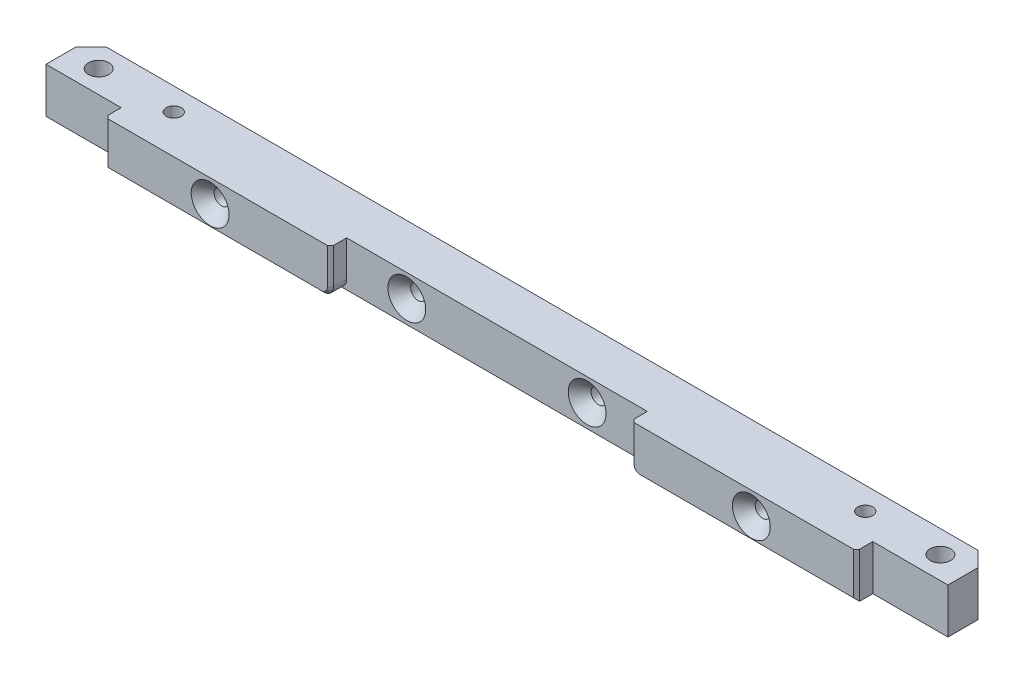
ISO-10303-21;
HEADER;
FILE_DESCRIPTION(('STEP AP214'),'2;1');
FILE_NAME('part.step','',(''),(''),'','','');
FILE_SCHEMA(('AUTOMOTIVE_DESIGN { 1 0 10303 214 1 1 1 1 }'));
ENDSEC;
DATA;
#1=APPLICATION_CONTEXT('core data for automotive mechanical design processes');
#2=APPLICATION_PROTOCOL_DEFINITION('international standard','automotive_design',2000,#1);
#3=PRODUCT_CONTEXT('',#1,'mechanical');
#4=PRODUCT('Part','Part','',(#3));
#5=PRODUCT_RELATED_PRODUCT_CATEGORY('part','',(#4));
#6=PRODUCT_DEFINITION_FORMATION('','',#4);
#7=PRODUCT_DEFINITION_CONTEXT('part definition',#1,'design');
#8=PRODUCT_DEFINITION('design','',#6,#7);
#9=PRODUCT_DEFINITION_SHAPE('','',#8);
#10=(LENGTH_UNIT() NAMED_UNIT(*) SI_UNIT(.MILLI.,.METRE.));
#11=(NAMED_UNIT(*) PLANE_ANGLE_UNIT() SI_UNIT($,.RADIAN.));
#12=(NAMED_UNIT(*) SI_UNIT($,.STERADIAN.) SOLID_ANGLE_UNIT());
#13=UNCERTAINTY_MEASURE_WITH_UNIT(LENGTH_MEASURE(1.E-05),#10,'distance_accuracy_value','');
#14=(GEOMETRIC_REPRESENTATION_CONTEXT(3) GLOBAL_UNCERTAINTY_ASSIGNED_CONTEXT((#13)) GLOBAL_UNIT_ASSIGNED_CONTEXT((#10,
#11,#12)) REPRESENTATION_CONTEXT('',''));
#15=CARTESIAN_POINT('',(0.,0.,0.));
#16=DIRECTION('',(0.,0.,1.));
#17=DIRECTION('',(1.,0.,0.));
#18=AXIS2_PLACEMENT_3D('',#15,#16,#17);
#19=CARTESIAN_POINT('',(0.,0.,12.9));
#20=DIRECTION('',(0.,0.,1.));
#21=DIRECTION('',(1.,0.,0.));
#22=AXIS2_PLACEMENT_3D('',#19,#20,#21);
#23=PLANE('',#22);
#24=CARTESIAN_POINT('',(-90.,7.50000000000002,12.9));
#25=DIRECTION('',(0.,0.,1.));
#26=DIRECTION('',(1.,0.,0.));
#27=AXIS2_PLACEMENT_3D('',#24,#25,#26);
#28=CIRCLE('',#27,6.3);
#29=CARTESIAN_POINT('',(-83.7,7.50000000000002,12.9));
#30=VERTEX_POINT('',#29);
#31=EDGE_CURVE('E577',#30,#30,#28,.T.);
#32=ORIENTED_EDGE('',*,*,#31,.F.);
#33=EDGE_LOOP('',(#32));
#34=FACE_BOUND('',#33,.T.);
#35=CARTESIAN_POINT('',(-53.,3.,12.9));
#36=DIRECTION('',(0.,0.,1.));
#37=DIRECTION('',(1.,0.,0.));
#38=AXIS2_PLACEMENT_3D('',#35,#36,#37);
#39=CIRCLE('',#38,2.);
#40=CARTESIAN_POINT('',(-53.,1.,12.9));
#41=VERTEX_POINT('',#40);
#42=CARTESIAN_POINT('',(-51.,3.,12.9));
#43=VERTEX_POINT('',#42);
#44=EDGE_CURVE('E66',#41,#43,#39,.T.);
#45=ORIENTED_EDGE('',*,*,#44,.T.);
#46=DIRECTION('',(0.,1.,0.));
#47=VECTOR('',#46,1.);
#48=CARTESIAN_POINT('',(-51.,15.,12.9));
#49=LINE('',#48,#47);
#50=CARTESIAN_POINT('',(-51.,15.,12.9));
#51=VERTEX_POINT('',#50);
#52=EDGE_CURVE('E411',#43,#51,#49,.T.);
#53=ORIENTED_EDGE('',*,*,#52,.T.);
#54=DIRECTION('',(-1.,0.,0.));
#55=VECTOR('',#54,1.);
#56=CARTESIAN_POINT('',(-125.,15.,12.9));
#57=LINE('',#56,#55);
#58=CARTESIAN_POINT('',(-124.,15.,12.9));
#59=VERTEX_POINT('',#58);
#60=EDGE_CURVE('E223',#51,#59,#57,.T.);
#61=ORIENTED_EDGE('',*,*,#60,.T.);
#62=DIRECTION('',(0.,-1.,0.));
#63=VECTOR('',#62,1.);
#64=CARTESIAN_POINT('',(-124.,0.,12.9));
#65=LINE('',#64,#63);
#66=CARTESIAN_POINT('',(-124.,1.,12.9));
#67=VERTEX_POINT('',#66);
#68=EDGE_CURVE('E403',#59,#67,#65,.T.);
#69=ORIENTED_EDGE('',*,*,#68,.T.);
#70=DIRECTION('',(1.,0.,0.));
#71=VECTOR('',#70,1.);
#72=CARTESIAN_POINT('',(-53.,1.,12.9));
#73=LINE('',#72,#71);
#74=EDGE_CURVE('E406',#67,#41,#73,.T.);
#75=ORIENTED_EDGE('',*,*,#74,.T.);
#76=EDGE_LOOP('',(#45,#53,#61,#69,#75));
#77=FACE_BOUND('',#76,.T.);
#78=ADVANCED_FACE('F41',(#34,#77),#23,.T.);
#79=CARTESIAN_POINT('',(-150.,15.,7.5));
#80=DIRECTION('',(0.,0.,-1.));
#81=DIRECTION('',(-1.,0.,0.));
#82=AXIS2_PLACEMENT_3D('',#79,#80,#81);
#83=PLANE('',#82);
#84=DIRECTION('',(0.,-1.,0.));
#85=VECTOR('',#84,1.);
#86=CARTESIAN_POINT('',(-125.,15.,7.5));
#87=LINE('',#86,#85);
#88=CARTESIAN_POINT('',(-125.,15.,7.5));
#89=VERTEX_POINT('',#88);
#90=CARTESIAN_POINT('',(-125.,0.,7.5));
#91=VERTEX_POINT('',#90);
#92=EDGE_CURVE('E221',#89,#91,#87,.T.);
#93=ORIENTED_EDGE('',*,*,#92,.F.);
#94=DIRECTION('',(1.,0.,0.));
#95=VECTOR('',#94,1.);
#96=CARTESIAN_POINT('',(-150.,15.,7.5));
#97=LINE('',#96,#95);
#98=CARTESIAN_POINT('',(-150.,15.,7.5));
#99=VERTEX_POINT('',#98);
#100=EDGE_CURVE('E293',#99,#89,#97,.T.);
#101=ORIENTED_EDGE('',*,*,#100,.F.);
#102=DIRECTION('',(0.,-1.,0.));
#103=VECTOR('',#102,1.);
#104=CARTESIAN_POINT('',(-150.,15.,7.5));
#105=LINE('',#104,#103);
#106=CARTESIAN_POINT('',(-150.,0.,7.5));
#107=VERTEX_POINT('',#106);
#108=EDGE_CURVE('E315',#99,#107,#105,.T.);
#109=ORIENTED_EDGE('',*,*,#108,.T.);
#110=DIRECTION('',(1.,0.,0.));
#111=VECTOR('',#110,1.);
#112=CARTESIAN_POINT('',(-150.,0.,7.5));
#113=LINE('',#112,#111);
#114=EDGE_CURVE('E285',#107,#91,#113,.T.);
#115=ORIENTED_EDGE('',*,*,#114,.T.);
#116=EDGE_LOOP('',(#93,#101,#109,#115));
#117=FACE_BOUND('',#116,.T.);
#118=ADVANCED_FACE('F469',(#117),#83,.F.);
#119=DIRECTION('',(0.,1.,0.));
#120=VECTOR('',#119,1.);
#121=CARTESIAN_POINT('',(125.,15.,7.5));
#122=LINE('',#121,#120);
#123=CARTESIAN_POINT('',(125.,0.,7.5));
#124=VERTEX_POINT('',#123);
#125=CARTESIAN_POINT('',(125.,15.,7.5));
#126=VERTEX_POINT('',#125);
#127=EDGE_CURVE('E228',#124,#126,#122,.T.);
#128=ORIENTED_EDGE('',*,*,#127,.F.);
#129=CARTESIAN_POINT('',(150.,0.,7.5));
#130=VERTEX_POINT('',#129);
#131=EDGE_CURVE('E308',#124,#130,#113,.T.);
#132=ORIENTED_EDGE('',*,*,#131,.T.);
#133=DIRECTION('',(0.,-1.,0.));
#134=VECTOR('',#133,1.);
#135=CARTESIAN_POINT('',(150.,15.,7.5));
#136=LINE('',#135,#134);
#137=CARTESIAN_POINT('',(150.,15.,7.5));
#138=VERTEX_POINT('',#137);
#139=EDGE_CURVE('E297',#138,#130,#136,.T.);
#140=ORIENTED_EDGE('',*,*,#139,.F.);
#141=EDGE_CURVE('E292',#126,#138,#97,.T.);
#142=ORIENTED_EDGE('',*,*,#141,.F.);
#143=EDGE_LOOP('',(#128,#132,#140,#142));
#144=FACE_BOUND('',#143,.T.);
#145=ADVANCED_FACE('F507',(#144),#83,.F.);
#146=CARTESIAN_POINT('',(150.,15.,-7.5));
#147=DIRECTION('',(-1.,0.,0.));
#148=DIRECTION('',(0.,0.,1.));
#149=AXIS2_PLACEMENT_3D('',#146,#147,#148);
#150=PLANE('',#149);
#151=DIRECTION('',(0.,0.,-1.));
#152=VECTOR('',#151,1.);
#153=CARTESIAN_POINT('',(150.,0.,-7.5));
#154=LINE('',#153,#152);
#155=CARTESIAN_POINT('',(150.,0.,-2.5));
#156=VERTEX_POINT('',#155);
#157=EDGE_CURVE('E279',#130,#156,#154,.T.);
#158=ORIENTED_EDGE('',*,*,#157,.T.);
#159=DIRECTION('',(0.,1.,0.));
#160=VECTOR('',#159,1.);
#161=CARTESIAN_POINT('',(150.,15.,-2.5));
#162=LINE('',#161,#160);
#163=CARTESIAN_POINT('',(150.,15.,-2.5));
#164=VERTEX_POINT('',#163);
#165=EDGE_CURVE('E351',#156,#164,#162,.T.);
#166=ORIENTED_EDGE('',*,*,#165,.T.);
#167=DIRECTION('',(0.,0.,-1.));
#168=VECTOR('',#167,1.);
#169=CARTESIAN_POINT('',(150.,15.,-7.5));
#170=LINE('',#169,#168);
#171=EDGE_CURVE('E280',#138,#164,#170,.T.);
#172=ORIENTED_EDGE('',*,*,#171,.F.);
#173=ORIENTED_EDGE('',*,*,#139,.T.);
#174=EDGE_LOOP('',(#158,#166,#172,#173));
#175=FACE_BOUND('',#174,.T.);
#176=ADVANCED_FACE('F799',(#175),#150,.F.);
#177=CARTESIAN_POINT('',(-150.,15.,-7.5));
#178=DIRECTION('',(0.,0.,1.));
#179=DIRECTION('',(1.,0.,0.));
#180=AXIS2_PLACEMENT_3D('',#177,#178,#179);
#181=PLANE('',#180);
#182=CARTESIAN_POINT('',(-30.,7.50000000000003,-7.5));
#183=DIRECTION('',(0.,0.,1.));
#184=DIRECTION('',(1.,0.,0.));
#185=AXIS2_PLACEMENT_3D('',#182,#183,#184);
#186=CIRCLE('',#185,2.5);
#187=CARTESIAN_POINT('',(-27.5,7.50000000000003,-7.5));
#188=VERTEX_POINT('',#187);
#189=EDGE_CURVE('E593',#188,#188,#186,.T.);
#190=ORIENTED_EDGE('',*,*,#189,.T.);
#191=EDGE_LOOP('',(#190));
#192=FACE_BOUND('',#191,.T.);
#193=CARTESIAN_POINT('',(30.,7.50000000000003,-7.5));
#194=DIRECTION('',(0.,0.,1.));
#195=DIRECTION('',(1.,0.,0.));
#196=AXIS2_PLACEMENT_3D('',#193,#194,#195);
#197=CIRCLE('',#196,2.5);
#198=CARTESIAN_POINT('',(32.5,7.50000000000003,-7.5));
#199=VERTEX_POINT('',#198);
#200=EDGE_CURVE('E581',#199,#199,#197,.T.);
#201=ORIENTED_EDGE('',*,*,#200,.T.);
#202=EDGE_LOOP('',(#201));
#203=FACE_BOUND('',#202,.T.);
#204=CARTESIAN_POINT('',(-90.,7.50000000000002,-7.5));
#205=DIRECTION('',(0.,0.,1.));
#206=DIRECTION('',(1.,0.,0.));
#207=AXIS2_PLACEMENT_3D('',#204,#205,#206);
#208=CIRCLE('',#207,2.49999999999999);
#209=CARTESIAN_POINT('',(-87.5,7.50000000000002,-7.5));
#210=VERTEX_POINT('',#209);
#211=EDGE_CURVE('E569',#210,#210,#208,.T.);
#212=ORIENTED_EDGE('',*,*,#211,.T.);
#213=EDGE_LOOP('',(#212));
#214=FACE_BOUND('',#213,.T.);
#215=CARTESIAN_POINT('',(90.,7.50000000000004,-7.5));
#216=DIRECTION('',(0.,0.,1.));
#217=DIRECTION('',(1.,0.,0.));
#218=AXIS2_PLACEMENT_3D('',#215,#216,#217);
#219=CIRCLE('',#218,2.49999999999999);
#220=CARTESIAN_POINT('',(92.5,7.50000000000004,-7.5));
#221=VERTEX_POINT('',#220);
#222=EDGE_CURVE('E557',#221,#221,#219,.T.);
#223=ORIENTED_EDGE('',*,*,#222,.T.);
#224=EDGE_LOOP('',(#223));
#225=FACE_BOUND('',#224,.T.);
#226=DIRECTION('',(-1.,0.,0.));
#227=VECTOR('',#226,1.);
#228=CARTESIAN_POINT('',(-150.,15.,-7.5));
#229=LINE('',#228,#227);
#230=CARTESIAN_POINT('',(145.,15.,-7.5));
#231=VERTEX_POINT('',#230);
#232=CARTESIAN_POINT('',(-145.,15.,-7.5));
#233=VERTEX_POINT('',#232);
#234=EDGE_CURVE('E284',#231,#233,#229,.T.);
#235=ORIENTED_EDGE('',*,*,#234,.F.);
#236=DIRECTION('',(0.,-1.,0.));
#237=VECTOR('',#236,1.);
#238=CARTESIAN_POINT('',(145.,15.,-7.5));
#239=LINE('',#238,#237);
#240=CARTESIAN_POINT('',(145.,0.,-7.5));
#241=VERTEX_POINT('',#240);
#242=EDGE_CURVE('E341',#231,#241,#239,.T.);
#243=ORIENTED_EDGE('',*,*,#242,.T.);
#244=DIRECTION('',(-1.,0.,0.));
#245=VECTOR('',#244,1.);
#246=CARTESIAN_POINT('',(-150.,0.,-7.5));
#247=LINE('',#246,#245);
#248=CARTESIAN_POINT('',(-145.,0.,-7.5));
#249=VERTEX_POINT('',#248);
#250=EDGE_CURVE('E301',#241,#249,#247,.T.);
#251=ORIENTED_EDGE('',*,*,#250,.T.);
#252=DIRECTION('',(0.,1.,0.));
#253=VECTOR('',#252,1.);
#254=CARTESIAN_POINT('',(-145.,15.,-7.5));
#255=LINE('',#254,#253);
#256=EDGE_CURVE('E338',#249,#233,#255,.T.);
#257=ORIENTED_EDGE('',*,*,#256,.T.);
#258=EDGE_LOOP('',(#235,#243,#251,#257));
#259=FACE_BOUND('',#258,.T.);
#260=ADVANCED_FACE('F482',(#192,#203,#214,#225,#259),#181,.F.);
#261=CARTESIAN_POINT('',(-150.,15.,-7.5));
#262=DIRECTION('',(1.,0.,0.));
#263=DIRECTION('',(0.,0.,-1.));
#264=AXIS2_PLACEMENT_3D('',#261,#262,#263);
#265=PLANE('',#264);
#266=DIRECTION('',(0.,0.,1.));
#267=VECTOR('',#266,1.);
#268=CARTESIAN_POINT('',(-150.,15.,-7.5));
#269=LINE('',#268,#267);
#270=CARTESIAN_POINT('',(-150.,15.,-2.5));
#271=VERTEX_POINT('',#270);
#272=EDGE_CURVE('E289',#271,#99,#269,.T.);
#273=ORIENTED_EDGE('',*,*,#272,.F.);
#274=DIRECTION('',(0.,-1.,0.));
#275=VECTOR('',#274,1.);
#276=CARTESIAN_POINT('',(-150.,15.,-2.5));
#277=LINE('',#276,#275);
#278=CARTESIAN_POINT('',(-150.,0.,-2.5));
#279=VERTEX_POINT('',#278);
#280=EDGE_CURVE('E360',#271,#279,#277,.T.);
#281=ORIENTED_EDGE('',*,*,#280,.T.);
#282=DIRECTION('',(0.,0.,1.));
#283=VECTOR('',#282,1.);
#284=CARTESIAN_POINT('',(-150.,0.,-7.5));
#285=LINE('',#284,#283);
#286=EDGE_CURVE('E305',#279,#107,#285,.T.);
#287=ORIENTED_EDGE('',*,*,#286,.T.);
#288=ORIENTED_EDGE('',*,*,#108,.F.);
#289=EDGE_LOOP('',(#273,#281,#287,#288));
#290=FACE_BOUND('',#289,.T.);
#291=ADVANCED_FACE('F475',(#290),#265,.F.);
#292=CARTESIAN_POINT('',(0.,15.,0.));
#293=DIRECTION('',(0.,1.,0.));
#294=DIRECTION('',(0.,0.,1.));
#295=AXIS2_PLACEMENT_3D('',#292,#293,#294);
#296=PLANE('',#295);
#297=CARTESIAN_POINT('',(124.,15.,12.9));
#298=VERTEX_POINT('',#297);
#299=CARTESIAN_POINT('',(51.,15.,12.9));
#300=VERTEX_POINT('',#299);
#301=EDGE_CURVE('E227',#298,#300,#57,.T.);
#302=ORIENTED_EDGE('',*,*,#301,.F.);
#303=DIRECTION('',(0.707106781186548,0.,-0.707106781186548));
#304=VECTOR('',#303,1.);
#305=CARTESIAN_POINT('',(68.45,15.,68.45));
#306=LINE('',#305,#304);
#307=CARTESIAN_POINT('',(125.,15.,11.9));
#308=VERTEX_POINT('',#307);
#309=EDGE_CURVE('E386',#298,#308,#306,.T.);
#310=ORIENTED_EDGE('',*,*,#309,.T.);
#311=DIRECTION('',(0.,0.,-1.));
#312=VECTOR('',#311,1.);
#313=CARTESIAN_POINT('',(125.,15.,12.9));
#314=LINE('',#313,#312);
#315=EDGE_CURVE('E238',#308,#126,#314,.T.);
#316=ORIENTED_EDGE('',*,*,#315,.T.);
#317=ORIENTED_EDGE('',*,*,#141,.T.);
#318=ORIENTED_EDGE('',*,*,#171,.T.);
#319=DIRECTION('',(0.707106781186544,0.,0.707106781186551));
#320=VECTOR('',#319,1.);
#321=CARTESIAN_POINT('',(76.2500000000008,15.,-76.25));
#322=LINE('',#321,#320);
#323=EDGE_CURVE('E357',#164,#231,#322,.F.);
#324=ORIENTED_EDGE('',*,*,#323,.T.);
#325=ORIENTED_EDGE('',*,*,#234,.T.);
#326=DIRECTION('',(0.707106781186549,0.,-0.707106781186546));
#327=VECTOR('',#326,1.);
#328=CARTESIAN_POINT('',(-76.2499999999996,15.,-76.25));
#329=LINE('',#328,#327);
#330=EDGE_CURVE('E354',#233,#271,#329,.F.);
#331=ORIENTED_EDGE('',*,*,#330,.T.);
#332=ORIENTED_EDGE('',*,*,#272,.T.);
#333=ORIENTED_EDGE('',*,*,#100,.T.);
#334=DIRECTION('',(0.,0.,-1.));
#335=VECTOR('',#334,1.);
#336=CARTESIAN_POINT('',(-125.,15.,12.9));
#337=LINE('',#336,#335);
#338=CARTESIAN_POINT('',(-125.,15.,11.9));
#339=VERTEX_POINT('',#338);
#340=EDGE_CURVE('E235',#339,#89,#337,.T.);
#341=ORIENTED_EDGE('',*,*,#340,.F.);
#342=DIRECTION('',(0.707106781186548,0.,0.707106781186548));
#343=VECTOR('',#342,1.);
#344=CARTESIAN_POINT('',(-68.45,15.,68.45));
#345=LINE('',#344,#343);
#346=EDGE_CURVE('E377',#339,#59,#345,.T.);
#347=ORIENTED_EDGE('',*,*,#346,.T.);
#348=ORIENTED_EDGE('',*,*,#60,.F.);
#349=DIRECTION('',(0.707106781186548,0.,-0.707106781186548));
#350=VECTOR('',#349,1.);
#351=CARTESIAN_POINT('',(-19.05,15.,-19.05));
#352=LINE('',#351,#350);
#353=CARTESIAN_POINT('',(-50.,15.,11.9));
#354=VERTEX_POINT('',#353);
#355=EDGE_CURVE('E380',#51,#354,#352,.T.);
#356=ORIENTED_EDGE('',*,*,#355,.T.);
#357=DIRECTION('',(0.,0.,1.));
#358=VECTOR('',#357,1.);
#359=CARTESIAN_POINT('',(-50.,15.,7.5));
#360=LINE('',#359,#358);
#361=CARTESIAN_POINT('',(-50.,15.,7.5));
#362=VERTEX_POINT('',#361);
#363=EDGE_CURVE('E211',#362,#354,#360,.T.);
#364=ORIENTED_EDGE('',*,*,#363,.F.);
#365=DIRECTION('',(-1.,0.,0.));
#366=VECTOR('',#365,1.);
#367=CARTESIAN_POINT('',(-50.,15.,7.5));
#368=LINE('',#367,#366);
#369=CARTESIAN_POINT('',(50.,15.,7.5));
#370=VERTEX_POINT('',#369);
#371=EDGE_CURVE('E192',#370,#362,#368,.T.);
#372=ORIENTED_EDGE('',*,*,#371,.F.);
#373=DIRECTION('',(0.,0.,1.));
#374=VECTOR('',#373,1.);
#375=CARTESIAN_POINT('',(50.,15.,7.5));
#376=LINE('',#375,#374);
#377=CARTESIAN_POINT('',(50.,15.,11.9));
#378=VERTEX_POINT('',#377);
#379=EDGE_CURVE('E204',#370,#378,#376,.T.);
#380=ORIENTED_EDGE('',*,*,#379,.T.);
#381=DIRECTION('',(0.707106781186548,0.,0.707106781186548));
#382=VECTOR('',#381,1.);
#383=CARTESIAN_POINT('',(19.05,15.,-19.05));
#384=LINE('',#383,#382);
#385=EDGE_CURVE('E383',#378,#300,#384,.T.);
#386=ORIENTED_EDGE('',*,*,#385,.T.);
#387=EDGE_LOOP('',(#302,#310,#316,#317,#318,#324,#325,#331,#332,#333,#341,#347,#348,#356,#364,
#372,#380,#386));
#388=FACE_BOUND('',#387,.T.);
#389=CARTESIAN_POINT('',(-140.,15.,0.));
#390=DIRECTION('',(0.,1.,0.));
#391=DIRECTION('',(0.,0.,1.));
#392=AXIS2_PLACEMENT_3D('',#389,#390,#391);
#393=CIRCLE('',#392,3.39999999999999);
#394=CARTESIAN_POINT('',(-140.,15.,3.39999999999999));
#395=VERTEX_POINT('',#394);
#396=EDGE_CURVE('E247',#395,#395,#393,.T.);
#397=ORIENTED_EDGE('',*,*,#396,.F.);
#398=EDGE_LOOP('',(#397));
#399=FACE_BOUND('',#398,.T.);
#400=CARTESIAN_POINT('',(140.,15.,0.));
#401=DIRECTION('',(0.,1.,0.));
#402=DIRECTION('',(0.,0.,1.));
#403=AXIS2_PLACEMENT_3D('',#400,#401,#402);
#404=CIRCLE('',#403,3.39999999999999);
#405=CARTESIAN_POINT('',(140.,15.,3.39999999999999));
#406=VERTEX_POINT('',#405);
#407=EDGE_CURVE('E255',#406,#406,#404,.T.);
#408=ORIENTED_EDGE('',*,*,#407,.F.);
#409=EDGE_LOOP('',(#408));
#410=FACE_BOUND('',#409,.T.);
#411=CARTESIAN_POINT('',(-115.,15.,0.));
#412=DIRECTION('',(0.,1.,0.));
#413=DIRECTION('',(0.,0.,1.));
#414=AXIS2_PLACEMENT_3D('',#411,#412,#413);
#415=CIRCLE('',#414,2.49999999999999);
#416=CARTESIAN_POINT('',(-115.,15.,2.49999999999999));
#417=VERTEX_POINT('',#416);
#418=EDGE_CURVE('E263',#417,#417,#415,.T.);
#419=ORIENTED_EDGE('',*,*,#418,.F.);
#420=EDGE_LOOP('',(#419));
#421=FACE_BOUND('',#420,.T.);
#422=CARTESIAN_POINT('',(115.,15.,0.));
#423=DIRECTION('',(0.,1.,0.));
#424=DIRECTION('',(0.,0.,1.));
#425=AXIS2_PLACEMENT_3D('',#422,#423,#424);
#426=CIRCLE('',#425,2.49999999999999);
#427=CARTESIAN_POINT('',(115.,15.,2.49999999999999));
#428=VERTEX_POINT('',#427);
#429=EDGE_CURVE('E271',#428,#428,#426,.T.);
#430=ORIENTED_EDGE('',*,*,#429,.F.);
#431=EDGE_LOOP('',(#430));
#432=FACE_BOUND('',#431,.T.);
#433=ADVANCED_FACE('F214',(#388,#399,#410,#421,#432),#296,.T.);
#434=CARTESIAN_POINT('',(0.,0.,0.));
#435=DIRECTION('',(0.,1.,0.));
#436=DIRECTION('',(0.,0.,1.));
#437=AXIS2_PLACEMENT_3D('',#434,#435,#436);
#438=PLANE('',#437);
#439=CARTESIAN_POINT('',(-140.,0.,0.));
#440=DIRECTION('',(0.,1.,0.));
#441=DIRECTION('',(0.,0.,1.));
#442=AXIS2_PLACEMENT_3D('',#439,#440,#441);
#443=CIRCLE('',#442,3.39999999999999);
#444=CARTESIAN_POINT('',(-140.,0.,3.39999999999999));
#445=VERTEX_POINT('',#444);
#446=EDGE_CURVE('E251',#445,#445,#443,.T.);
#447=ORIENTED_EDGE('',*,*,#446,.T.);
#448=EDGE_LOOP('',(#447));
#449=FACE_BOUND('',#448,.T.);
#450=CARTESIAN_POINT('',(140.,0.,0.));
#451=DIRECTION('',(0.,1.,0.));
#452=DIRECTION('',(0.,0.,1.));
#453=AXIS2_PLACEMENT_3D('',#450,#451,#452);
#454=CIRCLE('',#453,3.39999999999999);
#455=CARTESIAN_POINT('',(140.,0.,3.39999999999999));
#456=VERTEX_POINT('',#455);
#457=EDGE_CURVE('E259',#456,#456,#454,.T.);
#458=ORIENTED_EDGE('',*,*,#457,.T.);
#459=EDGE_LOOP('',(#458));
#460=FACE_BOUND('',#459,.T.);
#461=CARTESIAN_POINT('',(-115.,0.,0.));
#462=DIRECTION('',(0.,1.,0.));
#463=DIRECTION('',(0.,0.,1.));
#464=AXIS2_PLACEMENT_3D('',#461,#462,#463);
#465=CIRCLE('',#464,2.49999999999999);
#466=CARTESIAN_POINT('',(-115.,0.,2.49999999999999));
#467=VERTEX_POINT('',#466);
#468=EDGE_CURVE('E267',#467,#467,#465,.T.);
#469=ORIENTED_EDGE('',*,*,#468,.T.);
#470=EDGE_LOOP('',(#469));
#471=FACE_BOUND('',#470,.T.);
#472=CARTESIAN_POINT('',(115.,0.,0.));
#473=DIRECTION('',(0.,1.,0.));
#474=DIRECTION('',(0.,0.,1.));
#475=AXIS2_PLACEMENT_3D('',#472,#473,#474);
#476=CIRCLE('',#475,2.49999999999999);
#477=CARTESIAN_POINT('',(115.,0.,2.49999999999999));
#478=VERTEX_POINT('',#477);
#479=EDGE_CURVE('E275',#478,#478,#476,.T.);
#480=ORIENTED_EDGE('',*,*,#479,.T.);
#481=EDGE_LOOP('',(#480));
#482=FACE_BOUND('',#481,.T.);
#483=DIRECTION('',(0.,0.,-1.));
#484=VECTOR('',#483,1.);
#485=CARTESIAN_POINT('',(125.,0.,12.9));
#486=LINE('',#485,#484);
#487=CARTESIAN_POINT('',(125.,0.,11.9));
#488=VERTEX_POINT('',#487);
#489=EDGE_CURVE('E241',#488,#124,#486,.T.);
#490=ORIENTED_EDGE('',*,*,#489,.F.);
#491=DIRECTION('',(-1.,0.,0.));
#492=VECTOR('',#491,1.);
#493=CARTESIAN_POINT('',(53.,0.,11.9));
#494=LINE('',#493,#492);
#495=CARTESIAN_POINT('',(53.,0.,11.9));
#496=VERTEX_POINT('',#495);
#497=EDGE_CURVE('E395',#488,#496,#494,.T.);
#498=ORIENTED_EDGE('',*,*,#497,.T.);
#499=DIRECTION('',(0.,0.,1.));
#500=VECTOR('',#499,1.);
#501=CARTESIAN_POINT('',(53.,0.,0.));
#502=LINE('',#501,#500);
#503=CARTESIAN_POINT('',(53.,0.,7.5));
#504=VERTEX_POINT('',#503);
#505=EDGE_CURVE('E326',#496,#504,#502,.F.);
#506=ORIENTED_EDGE('',*,*,#505,.T.);
#507=DIRECTION('',(1.,0.,0.));
#508=VECTOR('',#507,1.);
#509=CARTESIAN_POINT('',(-50.,0.,7.5));
#510=LINE('',#509,#508);
#511=CARTESIAN_POINT('',(-53.,0.,7.5));
#512=VERTEX_POINT('',#511);
#513=EDGE_CURVE('E201',#512,#504,#510,.T.);
#514=ORIENTED_EDGE('',*,*,#513,.F.);
#515=DIRECTION('',(0.,0.,1.));
#516=VECTOR('',#515,1.);
#517=CARTESIAN_POINT('',(-53.,0.,0.));
#518=LINE('',#517,#516);
#519=CARTESIAN_POINT('',(-53.,0.,11.9));
#520=VERTEX_POINT('',#519);
#521=EDGE_CURVE('E322',#512,#520,#518,.T.);
#522=ORIENTED_EDGE('',*,*,#521,.T.);
#523=DIRECTION('',(-1.,0.,0.));
#524=VECTOR('',#523,1.);
#525=CARTESIAN_POINT('',(-125.,0.,11.9));
#526=LINE('',#525,#524);
#527=CARTESIAN_POINT('',(-125.,0.,11.9));
#528=VERTEX_POINT('',#527);
#529=EDGE_CURVE('E392',#520,#528,#526,.T.);
#530=ORIENTED_EDGE('',*,*,#529,.T.);
#531=DIRECTION('',(0.,0.,-1.));
#532=VECTOR('',#531,1.);
#533=CARTESIAN_POINT('',(-125.,0.,12.9));
#534=LINE('',#533,#532);
#535=EDGE_CURVE('E244',#528,#91,#534,.T.);
#536=ORIENTED_EDGE('',*,*,#535,.T.);
#537=ORIENTED_EDGE('',*,*,#114,.F.);
#538=ORIENTED_EDGE('',*,*,#286,.F.);
#539=DIRECTION('',(-0.707106781186549,0.,0.707106781186546));
#540=VECTOR('',#539,1.);
#541=CARTESIAN_POINT('',(-150.,0.,-2.5));
#542=LINE('',#541,#540);
#543=EDGE_CURVE('E345',#279,#249,#542,.F.);
#544=ORIENTED_EDGE('',*,*,#543,.T.);
#545=ORIENTED_EDGE('',*,*,#250,.F.);
#546=DIRECTION('',(-0.707106781186544,0.,-0.707106781186551));
#547=VECTOR('',#546,1.);
#548=CARTESIAN_POINT('',(145.,0.,-7.5));
#549=LINE('',#548,#547);
#550=EDGE_CURVE('E348',#241,#156,#549,.F.);
#551=ORIENTED_EDGE('',*,*,#550,.T.);
#552=ORIENTED_EDGE('',*,*,#157,.F.);
#553=ORIENTED_EDGE('',*,*,#131,.F.);
#554=EDGE_LOOP('',(#490,#498,#506,#514,#522,#530,#536,#537,#538,#544,#545,#551,#552,#553));
#555=FACE_BOUND('',#554,.T.);
#556=ADVANCED_FACE('F461',(#449,#460,#471,#482,#555),#438,.F.);
#557=CARTESIAN_POINT('',(115.,15.,0.));
#558=DIRECTION('',(0.,1.,0.));
#559=DIRECTION('',(0.,0.,1.));
#560=AXIS2_PLACEMENT_3D('',#557,#558,#559);
#561=CYLINDRICAL_SURFACE('',#560,2.49999999999999);
#562=ORIENTED_EDGE('',*,*,#479,.F.);
#563=EDGE_LOOP('',(#562));
#564=FACE_BOUND('',#563,.T.);
#565=ORIENTED_EDGE('',*,*,#429,.T.);
#566=EDGE_LOOP('',(#565));
#567=FACE_BOUND('',#566,.T.);
#568=ADVANCED_FACE('F749',(#564,#567),#561,.F.);
#569=CARTESIAN_POINT('',(-115.,15.,0.));
#570=DIRECTION('',(0.,1.,0.));
#571=DIRECTION('',(0.,0.,1.));
#572=AXIS2_PLACEMENT_3D('',#569,#570,#571);
#573=CYLINDRICAL_SURFACE('',#572,2.49999999999999);
#574=ORIENTED_EDGE('',*,*,#468,.F.);
#575=EDGE_LOOP('',(#574));
#576=FACE_BOUND('',#575,.T.);
#577=ORIENTED_EDGE('',*,*,#418,.T.);
#578=EDGE_LOOP('',(#577));
#579=FACE_BOUND('',#578,.T.);
#580=ADVANCED_FACE('F824',(#576,#579),#573,.F.);
#581=CARTESIAN_POINT('',(140.,15.,0.));
#582=DIRECTION('',(0.,1.,0.));
#583=DIRECTION('',(0.,0.,1.));
#584=AXIS2_PLACEMENT_3D('',#581,#582,#583);
#585=CYLINDRICAL_SURFACE('',#584,3.39999999999999);
#586=ORIENTED_EDGE('',*,*,#457,.F.);
#587=EDGE_LOOP('',(#586));
#588=FACE_BOUND('',#587,.T.);
#589=ORIENTED_EDGE('',*,*,#407,.T.);
#590=EDGE_LOOP('',(#589));
#591=FACE_BOUND('',#590,.T.);
#592=ADVANCED_FACE('F813',(#588,#591),#585,.F.);
#593=CARTESIAN_POINT('',(-140.,15.,0.));
#594=DIRECTION('',(0.,1.,0.));
#595=DIRECTION('',(0.,0.,1.));
#596=AXIS2_PLACEMENT_3D('',#593,#594,#595);
#597=CYLINDRICAL_SURFACE('',#596,3.39999999999999);
#598=ORIENTED_EDGE('',*,*,#446,.F.);
#599=EDGE_LOOP('',(#598));
#600=FACE_BOUND('',#599,.T.);
#601=ORIENTED_EDGE('',*,*,#396,.T.);
#602=EDGE_LOOP('',(#601));
#603=FACE_BOUND('',#602,.T.);
#604=ADVANCED_FACE('F761',(#600,#603),#597,.F.);
#605=CARTESIAN_POINT('',(-125.,15.,12.9));
#606=DIRECTION('',(1.,0.,0.));
#607=DIRECTION('',(0.,0.,-1.));
#608=AXIS2_PLACEMENT_3D('',#605,#606,#607);
#609=PLANE('',#608);
#610=ORIENTED_EDGE('',*,*,#535,.F.);
#611=DIRECTION('',(0.,1.,0.));
#612=VECTOR('',#611,1.);
#613=CARTESIAN_POINT('',(-125.,15.,11.9));
#614=LINE('',#613,#612);
#615=EDGE_CURVE('E11',#528,#339,#614,.T.);
#616=ORIENTED_EDGE('',*,*,#615,.T.);
#617=ORIENTED_EDGE('',*,*,#340,.T.);
#618=ORIENTED_EDGE('',*,*,#92,.T.);
#619=EDGE_LOOP('',(#610,#616,#617,#618));
#620=FACE_BOUND('',#619,.T.);
#621=ADVANCED_FACE('F465',(#620),#609,.F.);
#622=CARTESIAN_POINT('',(125.,15.,12.9));
#623=DIRECTION('',(-1.,0.,0.));
#624=DIRECTION('',(0.,0.,1.));
#625=AXIS2_PLACEMENT_3D('',#622,#623,#624);
#626=PLANE('',#625);
#627=ORIENTED_EDGE('',*,*,#315,.F.);
#628=DIRECTION('',(0.,-1.,0.));
#629=VECTOR('',#628,1.);
#630=CARTESIAN_POINT('',(125.,0.,11.9));
#631=LINE('',#630,#629);
#632=EDGE_CURVE('E389',#308,#488,#631,.T.);
#633=ORIENTED_EDGE('',*,*,#632,.T.);
#634=ORIENTED_EDGE('',*,*,#489,.T.);
#635=ORIENTED_EDGE('',*,*,#127,.T.);
#636=EDGE_LOOP('',(#627,#633,#634,#635));
#637=FACE_BOUND('',#636,.T.);
#638=ADVANCED_FACE('F514',(#637),#626,.F.);
#639=CARTESIAN_POINT('',(90.,7.50000000000004,12.9));
#640=DIRECTION('',(0.,0.,1.));
#641=DIRECTION('',(1.,0.,0.));
#642=AXIS2_PLACEMENT_3D('',#639,#640,#641);
#643=CIRCLE('',#642,6.3);
#644=CARTESIAN_POINT('',(96.3,7.50000000000004,12.9));
#645=VERTEX_POINT('',#644);
#646=EDGE_CURVE('E524',#645,#645,#643,.T.);
#647=ORIENTED_EDGE('',*,*,#646,.F.);
#648=EDGE_LOOP('',(#647));
#649=FACE_BOUND('',#648,.T.);
#650=DIRECTION('',(1.,0.,0.));
#651=VECTOR('',#650,1.);
#652=CARTESIAN_POINT('',(125.,1.,12.9));
#653=LINE('',#652,#651);
#654=CARTESIAN_POINT('',(53.,0.999999999999997,12.9));
#655=VERTEX_POINT('',#654);
#656=CARTESIAN_POINT('',(124.,1.,12.9));
#657=VERTEX_POINT('',#656);
#658=EDGE_CURVE('E370',#655,#657,#653,.T.);
#659=ORIENTED_EDGE('',*,*,#658,.T.);
#660=DIRECTION('',(0.,1.,0.));
#661=VECTOR('',#660,1.);
#662=CARTESIAN_POINT('',(124.,15.,12.9));
#663=LINE('',#662,#661);
#664=EDGE_CURVE('E373',#657,#298,#663,.T.);
#665=ORIENTED_EDGE('',*,*,#664,.T.);
#666=ORIENTED_EDGE('',*,*,#301,.T.);
#667=DIRECTION('',(0.,-1.,0.));
#668=VECTOR('',#667,1.);
#669=CARTESIAN_POINT('',(51.,3.,12.9));
#670=LINE('',#669,#668);
#671=CARTESIAN_POINT('',(51.,3.,12.9));
#672=VERTEX_POINT('',#671);
#673=EDGE_CURVE('E364',#300,#672,#670,.T.);
#674=ORIENTED_EDGE('',*,*,#673,.T.);
#675=CARTESIAN_POINT('',(53.,3.,12.9));
#676=DIRECTION('',(0.,0.,1.));
#677=DIRECTION('',(1.,0.,0.));
#678=AXIS2_PLACEMENT_3D('',#675,#676,#677);
#679=CIRCLE('',#678,2.);
#680=EDGE_CURVE('E367',#672,#655,#679,.T.);
#681=ORIENTED_EDGE('',*,*,#680,.T.);
#682=EDGE_LOOP('',(#659,#665,#666,#674,#681));
#683=FACE_BOUND('',#682,.T.);
#684=ADVANCED_FACE('F503',(#649,#683),#23,.T.);
#685=CARTESIAN_POINT('',(-50.,15.,7.5));
#686=DIRECTION('',(-1.,0.,0.));
#687=DIRECTION('',(0.,0.,1.));
#688=AXIS2_PLACEMENT_3D('',#685,#686,#687);
#689=PLANE('',#688);
#690=ORIENTED_EDGE('',*,*,#363,.T.);
#691=DIRECTION('',(0.,-1.,0.));
#692=VECTOR('',#691,1.);
#693=CARTESIAN_POINT('',(-50.,3.,11.9));
#694=LINE('',#693,#692);
#695=CARTESIAN_POINT('',(-50.,3.,11.9));
#696=VERTEX_POINT('',#695);
#697=EDGE_CURVE('E51',#354,#696,#694,.T.);
#698=ORIENTED_EDGE('',*,*,#697,.T.);
#699=DIRECTION('',(0.,0.,1.));
#700=VECTOR('',#699,1.);
#701=CARTESIAN_POINT('',(-50.,3.,7.5));
#702=LINE('',#701,#700);
#703=CARTESIAN_POINT('',(-50.,3.,7.5));
#704=VERTEX_POINT('',#703);
#705=EDGE_CURVE('E329',#696,#704,#702,.F.);
#706=ORIENTED_EDGE('',*,*,#705,.T.);
#707=DIRECTION('',(0.,-1.,0.));
#708=VECTOR('',#707,1.);
#709=CARTESIAN_POINT('',(-50.,15.,7.5));
#710=LINE('',#709,#708);
#711=EDGE_CURVE('E555',#362,#704,#710,.T.);
#712=ORIENTED_EDGE('',*,*,#711,.F.);
#713=EDGE_LOOP('',(#690,#698,#706,#712));
#714=FACE_BOUND('',#713,.T.);
#715=ADVANCED_FACE('F513',(#714),#689,.F.);
#716=CARTESIAN_POINT('',(50.,15.,7.5));
#717=DIRECTION('',(1.,0.,0.));
#718=DIRECTION('',(0.,0.,-1.));
#719=AXIS2_PLACEMENT_3D('',#716,#717,#718);
#720=PLANE('',#719);
#721=DIRECTION('',(0.,0.,1.));
#722=VECTOR('',#721,1.);
#723=CARTESIAN_POINT('',(50.,3.,7.5));
#724=LINE('',#723,#722);
#725=CARTESIAN_POINT('',(50.,3.,7.5));
#726=VERTEX_POINT('',#725);
#727=CARTESIAN_POINT('',(50.,3.,11.9));
#728=VERTEX_POINT('',#727);
#729=EDGE_CURVE('E319',#726,#728,#724,.T.);
#730=ORIENTED_EDGE('',*,*,#729,.T.);
#731=DIRECTION('',(0.,1.,0.));
#732=VECTOR('',#731,1.);
#733=CARTESIAN_POINT('',(50.,15.,11.9));
#734=LINE('',#733,#732);
#735=EDGE_CURVE('E207',#728,#378,#734,.T.);
#736=ORIENTED_EDGE('',*,*,#735,.T.);
#737=ORIENTED_EDGE('',*,*,#379,.F.);
#738=DIRECTION('',(0.,1.,0.));
#739=VECTOR('',#738,1.);
#740=CARTESIAN_POINT('',(50.,15.,7.5));
#741=LINE('',#740,#739);
#742=EDGE_CURVE('E187',#726,#370,#741,.T.);
#743=ORIENTED_EDGE('',*,*,#742,.F.);
#744=EDGE_LOOP('',(#730,#736,#737,#743));
#745=FACE_BOUND('',#744,.T.);
#746=ADVANCED_FACE('F205',(#745),#720,.F.);
#747=CARTESIAN_POINT('',(0.,0.,7.5));
#748=DIRECTION('',(0.,0.,1.));
#749=DIRECTION('',(1.,0.,0.));
#750=AXIS2_PLACEMENT_3D('',#747,#748,#749);
#751=PLANE('',#750);
#752=CARTESIAN_POINT('',(-30.,7.50000000000003,7.5));
#753=DIRECTION('',(0.,0.,1.));
#754=DIRECTION('',(1.,0.,0.));
#755=AXIS2_PLACEMENT_3D('',#752,#753,#754);
#756=CIRCLE('',#755,6.3);
#757=CARTESIAN_POINT('',(-23.7,7.50000000000003,7.5));
#758=VERTEX_POINT('',#757);
#759=EDGE_CURVE('E431',#758,#758,#756,.T.);
#760=ORIENTED_EDGE('',*,*,#759,.F.);
#761=EDGE_LOOP('',(#760));
#762=FACE_BOUND('',#761,.T.);
#763=CARTESIAN_POINT('',(30.,7.50000000000003,7.5));
#764=DIRECTION('',(0.,0.,1.));
#765=DIRECTION('',(1.,0.,0.));
#766=AXIS2_PLACEMENT_3D('',#763,#764,#765);
#767=CIRCLE('',#766,6.3);
#768=CARTESIAN_POINT('',(36.3,7.50000000000003,7.5));
#769=VERTEX_POINT('',#768);
#770=EDGE_CURVE('E589',#769,#769,#767,.T.);
#771=ORIENTED_EDGE('',*,*,#770,.F.);
#772=EDGE_LOOP('',(#771));
#773=FACE_BOUND('',#772,.T.);
#774=ORIENTED_EDGE('',*,*,#711,.T.);
#775=CARTESIAN_POINT('',(-53.,3.,7.5));
#776=DIRECTION('',(0.,0.,1.));
#777=DIRECTION('',(1.,0.,0.));
#778=AXIS2_PLACEMENT_3D('',#775,#776,#777);
#779=CIRCLE('',#778,3.);
#780=EDGE_CURVE('E334',#704,#512,#779,.F.);
#781=ORIENTED_EDGE('',*,*,#780,.T.);
#782=ORIENTED_EDGE('',*,*,#513,.T.);
#783=CARTESIAN_POINT('',(53.,3.,7.5));
#784=DIRECTION('',(0.,0.,1.));
#785=DIRECTION('',(1.,0.,0.));
#786=AXIS2_PLACEMENT_3D('',#783,#784,#785);
#787=CIRCLE('',#786,3.);
#788=EDGE_CURVE('E196',#504,#726,#787,.F.);
#789=ORIENTED_EDGE('',*,*,#788,.T.);
#790=ORIENTED_EDGE('',*,*,#742,.T.);
#791=ORIENTED_EDGE('',*,*,#371,.T.);
#792=EDGE_LOOP('',(#774,#781,#782,#789,#790,#791));
#793=FACE_BOUND('',#792,.T.);
#794=ADVANCED_FACE('F190',(#762,#773,#793),#751,.T.);
#795=CARTESIAN_POINT('',(90.,7.50000000000004,12.9));
#796=DIRECTION('',(0.,0.,1.));
#797=DIRECTION('',(1.,0.,0.));
#798=AXIS2_PLACEMENT_3D('',#795,#796,#797);
#799=CYLINDRICAL_SURFACE('',#798,2.5);
#800=ORIENTED_EDGE('',*,*,#222,.F.);
#801=EDGE_LOOP('',(#800));
#802=FACE_BOUND('',#801,.T.);
#803=CARTESIAN_POINT('',(90.,7.50000000000004,9.09999999999999));
#804=DIRECTION('',(0.,0.,1.));
#805=DIRECTION('',(1.,0.,0.));
#806=AXIS2_PLACEMENT_3D('',#803,#804,#805);
#807=CIRCLE('',#806,2.5);
#808=CARTESIAN_POINT('',(92.5,7.50000000000004,9.09999999999999));
#809=VERTEX_POINT('',#808);
#810=EDGE_CURVE('E563',#809,#809,#807,.T.);
#811=ORIENTED_EDGE('',*,*,#810,.T.);
#812=EDGE_LOOP('',(#811));
#813=FACE_BOUND('',#812,.T.);
#814=ADVANCED_FACE('F609',(#802,#813),#799,.F.);
#815=CARTESIAN_POINT('',(90.,7.50000000000004,12.9));
#816=DIRECTION('',(0.,0.,1.));
#817=DIRECTION('',(1.,0.,0.));
#818=AXIS2_PLACEMENT_3D('',#815,#816,#817);
#819=CONICAL_SURFACE('',#818,6.3,0.785398163397447);
#820=ORIENTED_EDGE('',*,*,#810,.F.);
#821=EDGE_LOOP('',(#820));
#822=FACE_BOUND('',#821,.T.);
#823=ORIENTED_EDGE('',*,*,#646,.T.);
#824=EDGE_LOOP('',(#823));
#825=FACE_BOUND('',#824,.T.);
#826=ADVANCED_FACE('F637',(#822,#825),#819,.F.);
#827=CARTESIAN_POINT('',(-90.,7.50000000000002,12.9));
#828=DIRECTION('',(0.,0.,1.));
#829=DIRECTION('',(1.,0.,0.));
#830=AXIS2_PLACEMENT_3D('',#827,#828,#829);
#831=CYLINDRICAL_SURFACE('',#830,2.5);
#832=ORIENTED_EDGE('',*,*,#211,.F.);
#833=EDGE_LOOP('',(#832));
#834=FACE_BOUND('',#833,.T.);
#835=CARTESIAN_POINT('',(-90.,7.50000000000002,9.09999999999999));
#836=DIRECTION('',(0.,0.,1.));
#837=DIRECTION('',(1.,0.,0.));
#838=AXIS2_PLACEMENT_3D('',#835,#836,#837);
#839=CIRCLE('',#838,2.5);
#840=CARTESIAN_POINT('',(-87.5,7.50000000000002,9.09999999999999));
#841=VERTEX_POINT('',#840);
#842=EDGE_CURVE('E573',#841,#841,#839,.T.);
#843=ORIENTED_EDGE('',*,*,#842,.T.);
#844=EDGE_LOOP('',(#843));
#845=FACE_BOUND('',#844,.T.);
#846=ADVANCED_FACE('F633',(#834,#845),#831,.F.);
#847=CARTESIAN_POINT('',(-90.,7.50000000000002,12.9));
#848=DIRECTION('',(0.,0.,1.));
#849=DIRECTION('',(1.,0.,0.));
#850=AXIS2_PLACEMENT_3D('',#847,#848,#849);
#851=CONICAL_SURFACE('',#850,6.3,0.785398163397447);
#852=ORIENTED_EDGE('',*,*,#842,.F.);
#853=EDGE_LOOP('',(#852));
#854=FACE_BOUND('',#853,.T.);
#855=ORIENTED_EDGE('',*,*,#31,.T.);
#856=EDGE_LOOP('',(#855));
#857=FACE_BOUND('',#856,.T.);
#858=ADVANCED_FACE('F625',(#854,#857),#851,.F.);
#859=CARTESIAN_POINT('',(30.,7.50000000000003,7.5));
#860=DIRECTION('',(0.,0.,1.));
#861=DIRECTION('',(1.,0.,0.));
#862=AXIS2_PLACEMENT_3D('',#859,#860,#861);
#863=CYLINDRICAL_SURFACE('',#862,2.5);
#864=ORIENTED_EDGE('',*,*,#200,.F.);
#865=EDGE_LOOP('',(#864));
#866=FACE_BOUND('',#865,.T.);
#867=CARTESIAN_POINT('',(30.,7.50000000000003,3.7));
#868=DIRECTION('',(0.,0.,1.));
#869=DIRECTION('',(1.,0.,0.));
#870=AXIS2_PLACEMENT_3D('',#867,#868,#869);
#871=CIRCLE('',#870,2.5);
#872=CARTESIAN_POINT('',(32.5,7.50000000000003,3.7));
#873=VERTEX_POINT('',#872);
#874=EDGE_CURVE('E585',#873,#873,#871,.T.);
#875=ORIENTED_EDGE('',*,*,#874,.T.);
#876=EDGE_LOOP('',(#875));
#877=FACE_BOUND('',#876,.T.);
#878=ADVANCED_FACE('F616',(#866,#877),#863,.F.);
#879=CARTESIAN_POINT('',(30.,7.50000000000003,7.5));
#880=DIRECTION('',(0.,0.,1.));
#881=DIRECTION('',(1.,0.,0.));
#882=AXIS2_PLACEMENT_3D('',#879,#880,#881);
#883=CONICAL_SURFACE('',#882,6.3,0.785398163397448);
#884=ORIENTED_EDGE('',*,*,#874,.F.);
#885=EDGE_LOOP('',(#884));
#886=FACE_BOUND('',#885,.T.);
#887=ORIENTED_EDGE('',*,*,#770,.T.);
#888=EDGE_LOOP('',(#887));
#889=FACE_BOUND('',#888,.T.);
#890=ADVANCED_FACE('F613',(#886,#889),#883,.F.);
#891=CARTESIAN_POINT('',(-30.,7.50000000000003,7.5));
#892=DIRECTION('',(0.,0.,1.));
#893=DIRECTION('',(1.,0.,0.));
#894=AXIS2_PLACEMENT_3D('',#891,#892,#893);
#895=CYLINDRICAL_SURFACE('',#894,2.5);
#896=ORIENTED_EDGE('',*,*,#189,.F.);
#897=EDGE_LOOP('',(#896));
#898=FACE_BOUND('',#897,.T.);
#899=CARTESIAN_POINT('',(-30.,7.50000000000003,3.7));
#900=DIRECTION('',(0.,0.,1.));
#901=DIRECTION('',(1.,0.,0.));
#902=AXIS2_PLACEMENT_3D('',#899,#900,#901);
#903=CIRCLE('',#902,2.5);
#904=CARTESIAN_POINT('',(-27.5,7.50000000000003,3.7));
#905=VERTEX_POINT('',#904);
#906=EDGE_CURVE('E597',#905,#905,#903,.T.);
#907=ORIENTED_EDGE('',*,*,#906,.T.);
#908=EDGE_LOOP('',(#907));
#909=FACE_BOUND('',#908,.T.);
#910=ADVANCED_FACE('F615',(#898,#909),#895,.F.);
#911=CARTESIAN_POINT('',(-30.,7.50000000000003,7.5));
#912=DIRECTION('',(0.,0.,1.));
#913=DIRECTION('',(1.,0.,0.));
#914=AXIS2_PLACEMENT_3D('',#911,#912,#913);
#915=CONICAL_SURFACE('',#914,6.3,0.785398163397449);
#916=ORIENTED_EDGE('',*,*,#906,.F.);
#917=EDGE_LOOP('',(#916));
#918=FACE_BOUND('',#917,.T.);
#919=ORIENTED_EDGE('',*,*,#759,.T.);
#920=EDGE_LOOP('',(#919));
#921=FACE_BOUND('',#920,.T.);
#922=ADVANCED_FACE('F605',(#918,#921),#915,.F.);
#923=CARTESIAN_POINT('',(53.,3.,7.5));
#924=DIRECTION('',(0.,0.,1.));
#925=DIRECTION('',(1.,0.,0.));
#926=AXIS2_PLACEMENT_3D('',#923,#924,#925);
#927=CYLINDRICAL_SURFACE('',#926,3.);
#928=ORIENTED_EDGE('',*,*,#505,.F.);
#929=CARTESIAN_POINT('',(53.,3.,11.9));
#930=DIRECTION('',(0.,0.,1.));
#931=DIRECTION('',(1.,0.,0.));
#932=AXIS2_PLACEMENT_3D('',#929,#930,#931);
#933=CIRCLE('',#932,3.);
#934=EDGE_CURVE('E398',#496,#728,#933,.F.);
#935=ORIENTED_EDGE('',*,*,#934,.T.);
#936=ORIENTED_EDGE('',*,*,#729,.F.);
#937=ORIENTED_EDGE('',*,*,#788,.F.);
#938=EDGE_LOOP('',(#928,#935,#936,#937));
#939=FACE_BOUND('',#938,.T.);
#940=ADVANCED_FACE('F552',(#939),#927,.T.);
#941=CARTESIAN_POINT('',(-53.,3.,0.));
#942=DIRECTION('',(0.,0.,1.));
#943=DIRECTION('',(1.,0.,0.));
#944=AXIS2_PLACEMENT_3D('',#941,#942,#943);
#945=CYLINDRICAL_SURFACE('',#944,3.);
#946=ORIENTED_EDGE('',*,*,#705,.F.);
#947=CARTESIAN_POINT('',(-53.,3.,11.9));
#948=DIRECTION('',(0.,0.,1.));
#949=DIRECTION('',(1.,0.,0.));
#950=AXIS2_PLACEMENT_3D('',#947,#948,#949);
#951=CIRCLE('',#950,3.);
#952=EDGE_CURVE('E414',#696,#520,#951,.F.);
#953=ORIENTED_EDGE('',*,*,#952,.T.);
#954=ORIENTED_EDGE('',*,*,#521,.F.);
#955=ORIENTED_EDGE('',*,*,#780,.F.);
#956=EDGE_LOOP('',(#946,#953,#954,#955));
#957=FACE_BOUND('',#956,.T.);
#958=ADVANCED_FACE('F496',(#957),#945,.T.);
#959=CARTESIAN_POINT('',(145.,15.,-7.5));
#960=DIRECTION('',(-0.707106781186551,0.,0.707106781186544));
#961=DIRECTION('',(0.,-1.,0.));
#962=AXIS2_PLACEMENT_3D('',#959,#960,#961);
#963=PLANE('',#962);
#964=ORIENTED_EDGE('',*,*,#323,.F.);
#965=ORIENTED_EDGE('',*,*,#165,.F.);
#966=ORIENTED_EDGE('',*,*,#550,.F.);
#967=ORIENTED_EDGE('',*,*,#242,.F.);
#968=EDGE_LOOP('',(#964,#965,#966,#967));
#969=FACE_BOUND('',#968,.T.);
#970=ADVANCED_FACE('F487',(#969),#963,.F.);
#971=CARTESIAN_POINT('',(-150.,15.,-2.5));
#972=DIRECTION('',(0.707106781186545,0.,0.707106781186549));
#973=DIRECTION('',(0.,-1.,0.));
#974=AXIS2_PLACEMENT_3D('',#971,#972,#973);
#975=PLANE('',#974);
#976=ORIENTED_EDGE('',*,*,#330,.F.);
#977=ORIENTED_EDGE('',*,*,#256,.F.);
#978=ORIENTED_EDGE('',*,*,#543,.F.);
#979=ORIENTED_EDGE('',*,*,#280,.F.);
#980=EDGE_LOOP('',(#976,#977,#978,#979));
#981=FACE_BOUND('',#980,.T.);
#982=ADVANCED_FACE('F484',(#981),#975,.F.);
#983=CARTESIAN_POINT('',(50.,15.,11.9));
#984=DIRECTION('',(-0.707106781186547,0.,0.707106781186547));
#985=DIRECTION('',(0.,-1.,0.));
#986=AXIS2_PLACEMENT_3D('',#983,#984,#985);
#987=PLANE('',#986);
#988=ORIENTED_EDGE('',*,*,#385,.F.);
#989=ORIENTED_EDGE('',*,*,#735,.F.);
#990=DIRECTION('',(-0.707106781186547,0.,-0.707106781186547));
#991=VECTOR('',#990,1.);
#992=CARTESIAN_POINT('',(51.,3.,12.9));
#993=LINE('',#992,#991);
#994=EDGE_CURVE('E427',#672,#728,#993,.T.);
#995=ORIENTED_EDGE('',*,*,#994,.F.);
#996=ORIENTED_EDGE('',*,*,#673,.F.);
#997=EDGE_LOOP('',(#988,#989,#995,#996));
#998=FACE_BOUND('',#997,.T.);
#999=ADVANCED_FACE('F486',(#998),#987,.T.);
#1000=CARTESIAN_POINT('',(53.,3.,12.9));
#1001=DIRECTION('',(0.,0.,-1.));
#1002=DIRECTION('',(-1.,0.,0.));
#1003=AXIS2_PLACEMENT_3D('',#1000,#1001,#1002);
#1004=CONICAL_SURFACE('',#1003,2.,0.785398163397447);
#1005=ORIENTED_EDGE('',*,*,#994,.T.);
#1006=ORIENTED_EDGE('',*,*,#934,.F.);
#1007=DIRECTION('',(0.,-0.707106781186547,-0.707106781186548));
#1008=VECTOR('',#1007,1.);
#1009=CARTESIAN_POINT('',(53.,0.999999999999997,12.9));
#1010=LINE('',#1009,#1008);
#1011=EDGE_CURVE('E423',#655,#496,#1010,.T.);
#1012=ORIENTED_EDGE('',*,*,#1011,.F.);
#1013=ORIENTED_EDGE('',*,*,#680,.F.);
#1014=EDGE_LOOP('',(#1005,#1006,#1012,#1013));
#1015=FACE_BOUND('',#1014,.T.);
#1016=ADVANCED_FACE('F493',(#1015),#1004,.T.);
#1017=CARTESIAN_POINT('',(0.,1.,12.9));
#1018=DIRECTION('',(0.,-0.707106781186547,0.707106781186547));
#1019=DIRECTION('',(-1.,0.,0.));
#1020=AXIS2_PLACEMENT_3D('',#1017,#1018,#1019);
#1021=PLANE('',#1020);
#1022=ORIENTED_EDGE('',*,*,#1011,.T.);
#1023=ORIENTED_EDGE('',*,*,#497,.F.);
#1024=DIRECTION('',(-0.577350269189626,0.577350269189626,0.577350269189626));
#1025=VECTOR('',#1024,1.);
#1026=CARTESIAN_POINT('',(82.6666666666667,42.3333333333333,54.2333333333333));
#1027=LINE('',#1026,#1025);
#1028=EDGE_CURVE('E419',#657,#488,#1027,.F.);
#1029=ORIENTED_EDGE('',*,*,#1028,.F.);
#1030=ORIENTED_EDGE('',*,*,#658,.F.);
#1031=EDGE_LOOP('',(#1022,#1023,#1029,#1030));
#1032=FACE_BOUND('',#1031,.T.);
#1033=ADVANCED_FACE('F533',(#1032),#1021,.T.);
#1034=CARTESIAN_POINT('',(124.,0.,12.9));
#1035=DIRECTION('',(0.707106781186547,0.,0.707106781186547));
#1036=DIRECTION('',(0.,-1.,0.));
#1037=AXIS2_PLACEMENT_3D('',#1034,#1035,#1036);
#1038=PLANE('',#1037);
#1039=ORIENTED_EDGE('',*,*,#1028,.T.);
#1040=ORIENTED_EDGE('',*,*,#632,.F.);
#1041=ORIENTED_EDGE('',*,*,#309,.F.);
#1042=ORIENTED_EDGE('',*,*,#664,.F.);
#1043=EDGE_LOOP('',(#1039,#1040,#1041,#1042));
#1044=FACE_BOUND('',#1043,.T.);
#1045=ADVANCED_FACE('F536',(#1044),#1038,.T.);
#1046=CARTESIAN_POINT('',(-50.,15.,11.9));
#1047=DIRECTION('',(0.707106781186547,0.,0.707106781186547));
#1048=DIRECTION('',(0.,1.,0.));
#1049=AXIS2_PLACEMENT_3D('',#1046,#1047,#1048);
#1050=PLANE('',#1049);
#1051=ORIENTED_EDGE('',*,*,#355,.F.);
#1052=ORIENTED_EDGE('',*,*,#52,.F.);
#1053=DIRECTION('',(-0.707106781186547,0.,0.707106781186547));
#1054=VECTOR('',#1053,1.);
#1055=CARTESIAN_POINT('',(-50.,3.,11.9));
#1056=LINE('',#1055,#1054);
#1057=EDGE_CURVE('E45',#696,#43,#1056,.T.);
#1058=ORIENTED_EDGE('',*,*,#1057,.F.);
#1059=ORIENTED_EDGE('',*,*,#697,.F.);
#1060=EDGE_LOOP('',(#1051,#1052,#1058,#1059));
#1061=FACE_BOUND('',#1060,.T.);
#1062=ADVANCED_FACE('F43',(#1061),#1050,.T.);
#1063=CARTESIAN_POINT('',(-124.,0.,12.9));
#1064=DIRECTION('',(-0.707106781186547,0.,0.707106781186547));
#1065=DIRECTION('',(0.,1.,0.));
#1066=AXIS2_PLACEMENT_3D('',#1063,#1064,#1065);
#1067=PLANE('',#1066);
#1068=ORIENTED_EDGE('',*,*,#346,.F.);
#1069=ORIENTED_EDGE('',*,*,#615,.F.);
#1070=DIRECTION('',(0.577350269189626,0.577350269189626,0.577350269189626));
#1071=VECTOR('',#1070,1.);
#1072=CARTESIAN_POINT('',(-124.333333333333,0.666666666666667,12.5666666666667));
#1073=LINE('',#1072,#1071);
#1074=EDGE_CURVE('E434',#67,#528,#1073,.F.);
#1075=ORIENTED_EDGE('',*,*,#1074,.F.);
#1076=ORIENTED_EDGE('',*,*,#68,.F.);
#1077=EDGE_LOOP('',(#1068,#1069,#1075,#1076));
#1078=FACE_BOUND('',#1077,.T.);
#1079=ADVANCED_FACE('F456',(#1078),#1067,.T.);
#1080=CARTESIAN_POINT('',(-53.,3.,12.9));
#1081=DIRECTION('',(0.,0.,-1.));
#1082=DIRECTION('',(-1.,0.,0.));
#1083=AXIS2_PLACEMENT_3D('',#1080,#1081,#1082);
#1084=CONICAL_SURFACE('',#1083,2.,0.785398163397448);
#1085=ORIENTED_EDGE('',*,*,#1057,.T.);
#1086=ORIENTED_EDGE('',*,*,#44,.F.);
#1087=DIRECTION('',(0.,0.707106781186547,0.707106781186548));
#1088=VECTOR('',#1087,1.);
#1089=CARTESIAN_POINT('',(-53.,0.,11.9));
#1090=LINE('',#1089,#1088);
#1091=EDGE_CURVE('E432',#520,#41,#1090,.T.);
#1092=ORIENTED_EDGE('',*,*,#1091,.F.);
#1093=ORIENTED_EDGE('',*,*,#952,.F.);
#1094=EDGE_LOOP('',(#1085,#1086,#1092,#1093));
#1095=FACE_BOUND('',#1094,.T.);
#1096=ADVANCED_FACE('F446',(#1095),#1084,.T.);
#1097=CARTESIAN_POINT('',(0.,1.,12.9));
#1098=DIRECTION('',(0.,-0.707106781186547,0.707106781186547));
#1099=DIRECTION('',(-1.,0.,0.));
#1100=AXIS2_PLACEMENT_3D('',#1097,#1098,#1099);
#1101=PLANE('',#1100);
#1102=ORIENTED_EDGE('',*,*,#1074,.T.);
#1103=ORIENTED_EDGE('',*,*,#529,.F.);
#1104=ORIENTED_EDGE('',*,*,#1091,.T.);
#1105=ORIENTED_EDGE('',*,*,#74,.F.);
#1106=EDGE_LOOP('',(#1102,#1103,#1104,#1105));
#1107=FACE_BOUND('',#1106,.T.);
#1108=ADVANCED_FACE('F457',(#1107),#1101,.T.);
#1109=CLOSED_SHELL('',(#78,#118,#145,#176,#260,#291,#433,#556,#568,#580,#592,#604,#621,#638,
#684,#715,#746,#794,#814,#826,#846,#858,#878,#890,#910,#922,#940,#958,#970,#982,#999,#1016,
#1033,#1045,#1062,#1079,#1096,#1108));
#1110=MANIFOLD_SOLID_BREP('B2',#1109);
#1111=ADVANCED_BREP_SHAPE_REPRESENTATION('',(#18,#1110),#14);
#1112=SHAPE_DEFINITION_REPRESENTATION(#9,#1111);
ENDSEC;
END-ISO-10303-21;
